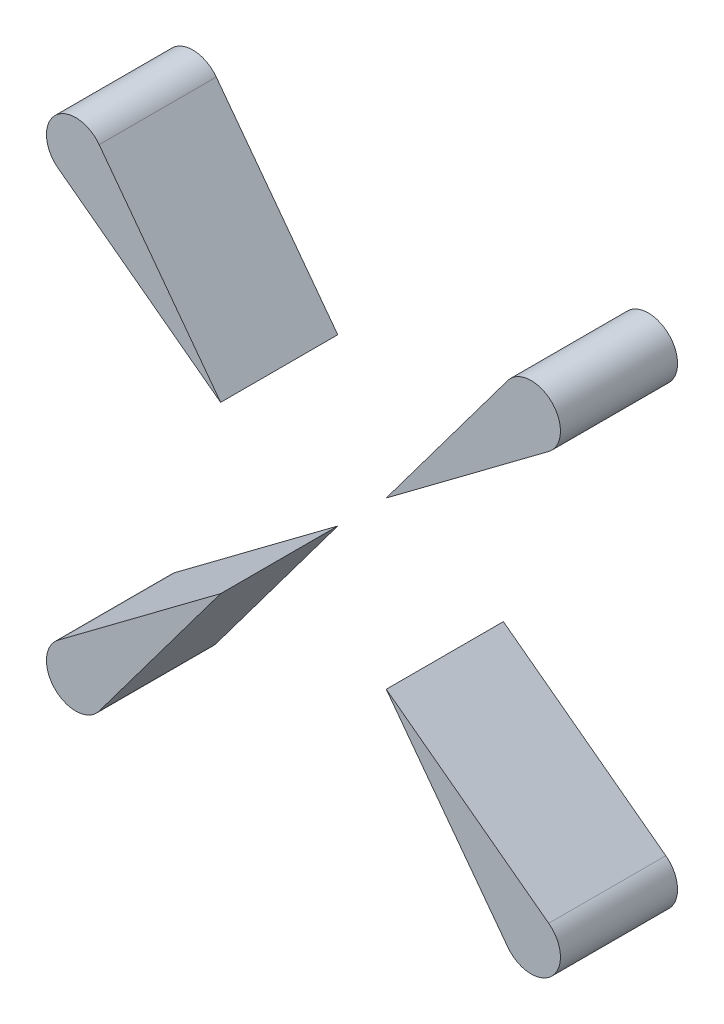
ISO-10303-21;
HEADER;
FILE_DESCRIPTION(('STEP AP214'),'2;1');
FILE_NAME('part.step','',(''),(''),'','','');
FILE_SCHEMA(('AUTOMOTIVE_DESIGN { 1 0 10303 214 1 1 1 1 }'));
ENDSEC;
DATA;
#1=APPLICATION_CONTEXT('core data for automotive mechanical design processes');
#2=APPLICATION_PROTOCOL_DEFINITION('international standard','automotive_design',2000,#1);
#3=PRODUCT_CONTEXT('',#1,'mechanical');
#4=PRODUCT('Part','Part','',(#3));
#5=PRODUCT_RELATED_PRODUCT_CATEGORY('part','',(#4));
#6=PRODUCT_DEFINITION_FORMATION('','',#4);
#7=PRODUCT_DEFINITION_CONTEXT('part definition',#1,'design');
#8=PRODUCT_DEFINITION('design','',#6,#7);
#9=PRODUCT_DEFINITION_SHAPE('','',#8);
#10=(LENGTH_UNIT() NAMED_UNIT(*) SI_UNIT(.MILLI.,.METRE.));
#11=(NAMED_UNIT(*) PLANE_ANGLE_UNIT() SI_UNIT($,.RADIAN.));
#12=(NAMED_UNIT(*) SI_UNIT($,.STERADIAN.) SOLID_ANGLE_UNIT());
#13=UNCERTAINTY_MEASURE_WITH_UNIT(LENGTH_MEASURE(1.E-05),#10,'distance_accuracy_value','');
#14=(GEOMETRIC_REPRESENTATION_CONTEXT(3) GLOBAL_UNCERTAINTY_ASSIGNED_CONTEXT((#13)) GLOBAL_UNIT_ASSIGNED_CONTEXT((#10,
#11,#12)) REPRESENTATION_CONTEXT('',''));
#15=CARTESIAN_POINT('',(0.,0.,0.));
#16=DIRECTION('',(0.,0.,1.));
#17=DIRECTION('',(1.,0.,0.));
#18=AXIS2_PLACEMENT_3D('',#15,#16,#17);
#19=CARTESIAN_POINT('',(-0.707106781186542,0.707106781186553,1.));
#20=DIRECTION('',(0.598838957768551,0.800869466678981,0.));
#21=DIRECTION('',(-0.800869466678981,0.598838957768551,0.));
#22=AXIS2_PLACEMENT_3D('',#19,#20,#21);
#23=PLANE('',#22);
#24=DIRECTION('',(0.800869466678981,-0.598838957768551,0.));
#25=VECTOR('',#24,1.);
#26=CARTESIAN_POINT('',(-0.707106781186542,0.707106781186553,0.));
#27=LINE('',#26,#25);
#28=CARTESIAN_POINT('',(-2.09425338770513,1.74432628159328,0.));
#29=VERTEX_POINT('',#28);
#30=CARTESIAN_POINT('',(-0.707106781186542,0.707106781186553,0.));
#31=VERTEX_POINT('',#30);
#32=EDGE_CURVE('E12',#29,#31,#27,.T.);
#33=ORIENTED_EDGE('',*,*,#32,.T.);
#34=DIRECTION('',(0.,0.,-1.));
#35=VECTOR('',#34,1.);
#36=CARTESIAN_POINT('',(-0.707106781186542,0.707106781186553,1.));
#37=LINE('',#36,#35);
#38=CARTESIAN_POINT('',(-0.707106781186542,0.707106781186553,1.));
#39=VERTEX_POINT('',#38);
#40=EDGE_CURVE('E148',#39,#31,#37,.T.);
#41=ORIENTED_EDGE('',*,*,#40,.F.);
#42=DIRECTION('',(0.800869466678981,-0.598838957768551,0.));
#43=VECTOR('',#42,1.);
#44=CARTESIAN_POINT('',(-0.707106781186542,0.707106781186553,1.));
#45=LINE('',#44,#43);
#46=CARTESIAN_POINT('',(-2.09425338770513,1.74432628159328,1.));
#47=VERTEX_POINT('',#46);
#48=EDGE_CURVE('E52',#47,#39,#45,.T.);
#49=ORIENTED_EDGE('',*,*,#48,.F.);
#50=DIRECTION('',(0.,0.,-1.));
#51=VECTOR('',#50,1.);
#52=CARTESIAN_POINT('',(-2.09425338770513,1.74432628159328,1.));
#53=LINE('',#52,#51);
#54=EDGE_CURVE('E90',#47,#29,#53,.T.);
#55=ORIENTED_EDGE('',*,*,#54,.T.);
#56=EDGE_LOOP('',(#33,#41,#49,#55));
#57=FACE_BOUND('',#56,.T.);
#58=ADVANCED_FACE('F48',(#57),#23,.F.);
#59=CARTESIAN_POINT('',(-1.74432628159324,2.09425338770516,1.));
#60=DIRECTION('',(-0.800869466678991,-0.598838957768537,0.));
#61=DIRECTION('',(0.598838957768537,-0.800869466678992,0.));
#62=AXIS2_PLACEMENT_3D('',#59,#60,#61);
#63=PLANE('',#62);
#64=DIRECTION('',(-0.598838957768537,0.800869466678991,0.));
#65=VECTOR('',#64,1.);
#66=CARTESIAN_POINT('',(-1.74432628159324,2.09425338770516,0.));
#67=LINE('',#66,#65);
#68=CARTESIAN_POINT('',(-1.74432628159324,2.09425338770516,0.));
#69=VERTEX_POINT('',#68);
#70=EDGE_CURVE('E58',#31,#69,#67,.T.);
#71=ORIENTED_EDGE('',*,*,#70,.T.);
#72=DIRECTION('',(0.,0.,-1.));
#73=VECTOR('',#72,1.);
#74=CARTESIAN_POINT('',(-1.74432628159324,2.09425338770516,1.));
#75=LINE('',#74,#73);
#76=CARTESIAN_POINT('',(-1.74432628159324,2.09425338770516,1.));
#77=VERTEX_POINT('',#76);
#78=EDGE_CURVE('E92',#77,#69,#75,.T.);
#79=ORIENTED_EDGE('',*,*,#78,.F.);
#80=DIRECTION('',(-0.598838957768537,0.800869466678991,0.));
#81=VECTOR('',#80,1.);
#82=CARTESIAN_POINT('',(-1.74432628159324,2.09425338770516,1.));
#83=LINE('',#82,#81);
#84=EDGE_CURVE('E79',#39,#77,#83,.T.);
#85=ORIENTED_EDGE('',*,*,#84,.F.);
#86=ORIENTED_EDGE('',*,*,#40,.T.);
#87=EDGE_LOOP('',(#71,#79,#85,#86));
#88=FACE_BOUND('',#87,.T.);
#89=ADVANCED_FACE('F105',(#88),#63,.F.);
#90=CARTESIAN_POINT('',(-1.94454364826299,1.94454364826302,1.));
#91=DIRECTION('',(0.,0.,-1.));
#92=DIRECTION('',(-1.,0.,0.));
#93=AXIS2_PLACEMENT_3D('',#90,#91,#92);
#94=CYLINDRICAL_SURFACE('',#93,0.25);
#95=CARTESIAN_POINT('',(-1.94454364826299,1.94454364826302,0.));
#96=DIRECTION('',(0.,0.,1.));
#97=DIRECTION('',(-1.,0.,0.));
#98=AXIS2_PLACEMENT_3D('',#95,#96,#97);
#99=CIRCLE('',#98,0.25);
#100=EDGE_CURVE('E86',#69,#29,#99,.T.);
#101=ORIENTED_EDGE('',*,*,#100,.T.);
#102=ORIENTED_EDGE('',*,*,#54,.F.);
#103=CARTESIAN_POINT('',(-1.94454364826299,1.94454364826302,1.));
#104=DIRECTION('',(0.,0.,1.));
#105=DIRECTION('',(-1.,0.,0.));
#106=AXIS2_PLACEMENT_3D('',#103,#104,#105);
#107=CIRCLE('',#106,0.25);
#108=EDGE_CURVE('E96',#77,#47,#107,.T.);
#109=ORIENTED_EDGE('',*,*,#108,.F.);
#110=ORIENTED_EDGE('',*,*,#78,.T.);
#111=EDGE_LOOP('',(#101,#102,#109,#110));
#112=FACE_BOUND('',#111,.T.);
#113=ADVANCED_FACE('F88',(#112),#94,.T.);
#114=CARTESIAN_POINT('',(-1.94454364826299,1.94454364826302,1.));
#115=DIRECTION('',(0.,0.,-1.));
#116=DIRECTION('',(-1.,0.,0.));
#117=AXIS2_PLACEMENT_3D('',#114,#115,#116);
#118=PLANE('',#117);
#119=ORIENTED_EDGE('',*,*,#48,.T.);
#120=ORIENTED_EDGE('',*,*,#84,.T.);
#121=ORIENTED_EDGE('',*,*,#108,.T.);
#122=EDGE_LOOP('',(#119,#120,#121));
#123=FACE_BOUND('',#122,.T.);
#124=ADVANCED_FACE('F50',(#123),#118,.F.);
#125=CARTESIAN_POINT('',(-1.94454364826299,1.94454364826302,0.));
#126=DIRECTION('',(0.,0.,-1.));
#127=DIRECTION('',(-1.,0.,0.));
#128=AXIS2_PLACEMENT_3D('',#125,#126,#127);
#129=PLANE('',#128);
#130=ORIENTED_EDGE('',*,*,#32,.F.);
#131=ORIENTED_EDGE('',*,*,#100,.F.);
#132=ORIENTED_EDGE('',*,*,#70,.F.);
#133=EDGE_LOOP('',(#130,#131,#132));
#134=FACE_BOUND('',#133,.T.);
#135=ADVANCED_FACE('F98',(#134),#129,.T.);
#136=CLOSED_SHELL('',(#58,#89,#113,#124,#135));
#137=MANIFOLD_SOLID_BREP('B2',#136);
#138=CARTESIAN_POINT('',(-0.707106781186551,-0.707106781186544,1.));
#139=DIRECTION('',(-0.800869466678983,0.598838957768548,0.));
#140=DIRECTION('',(-0.598838957768548,-0.800869466678984,0.));
#141=AXIS2_PLACEMENT_3D('',#138,#139,#140);
#142=PLANE('',#141);
#143=DIRECTION('',(0.598838957768548,0.800869466678983,0.));
#144=VECTOR('',#143,1.);
#145=CARTESIAN_POINT('',(-0.707106781186551,-0.707106781186544,0.));
#146=LINE('',#145,#144);
#147=CARTESIAN_POINT('',(-1.74432628159327,-2.09425338770513,0.));
#148=VERTEX_POINT('',#147);
#149=CARTESIAN_POINT('',(-0.707106781186551,-0.707106781186544,0.));
#150=VERTEX_POINT('',#149);
#151=EDGE_CURVE('E46',#148,#150,#146,.T.);
#152=ORIENTED_EDGE('',*,*,#151,.T.);
#153=DIRECTION('',(0.,0.,-1.));
#154=VECTOR('',#153,1.);
#155=CARTESIAN_POINT('',(-0.707106781186551,-0.707106781186544,1.));
#156=LINE('',#155,#154);
#157=CARTESIAN_POINT('',(-0.707106781186551,-0.707106781186544,1.));
#158=VERTEX_POINT('',#157);
#159=EDGE_CURVE('E266',#158,#150,#156,.T.);
#160=ORIENTED_EDGE('',*,*,#159,.F.);
#161=DIRECTION('',(0.598838957768548,0.800869466678983,0.));
#162=VECTOR('',#161,1.);
#163=CARTESIAN_POINT('',(-0.707106781186551,-0.707106781186544,1.));
#164=LINE('',#163,#162);
#165=CARTESIAN_POINT('',(-1.74432628159327,-2.09425338770513,1.));
#166=VERTEX_POINT('',#165);
#167=EDGE_CURVE('E170',#166,#158,#164,.T.);
#168=ORIENTED_EDGE('',*,*,#167,.F.);
#169=DIRECTION('',(0.,0.,-1.));
#170=VECTOR('',#169,1.);
#171=CARTESIAN_POINT('',(-1.74432628159327,-2.09425338770513,1.));
#172=LINE('',#171,#170);
#173=EDGE_CURVE('E208',#166,#148,#172,.T.);
#174=ORIENTED_EDGE('',*,*,#173,.T.);
#175=EDGE_LOOP('',(#152,#160,#168,#174));
#176=FACE_BOUND('',#175,.T.);
#177=ADVANCED_FACE('F166',(#176),#142,.F.);
#178=CARTESIAN_POINT('',(-2.09425338770515,-1.74432628159325,1.));
#179=DIRECTION('',(0.59883895776854,-0.800869466678989,0.));
#180=DIRECTION('',(0.800869466678989,0.59883895776854,0.));
#181=AXIS2_PLACEMENT_3D('',#178,#179,#180);
#182=PLANE('',#181);
#183=DIRECTION('',(-0.800869466678989,-0.59883895776854,0.));
#184=VECTOR('',#183,1.);
#185=CARTESIAN_POINT('',(-2.09425338770515,-1.74432628159325,0.));
#186=LINE('',#185,#184);
#187=CARTESIAN_POINT('',(-2.09425338770515,-1.74432628159325,0.));
#188=VERTEX_POINT('',#187);
#189=EDGE_CURVE('E176',#150,#188,#186,.T.);
#190=ORIENTED_EDGE('',*,*,#189,.T.);
#191=DIRECTION('',(0.,0.,-1.));
#192=VECTOR('',#191,1.);
#193=CARTESIAN_POINT('',(-2.09425338770515,-1.74432628159325,1.));
#194=LINE('',#193,#192);
#195=CARTESIAN_POINT('',(-2.09425338770515,-1.74432628159325,1.));
#196=VERTEX_POINT('',#195);
#197=EDGE_CURVE('E210',#196,#188,#194,.T.);
#198=ORIENTED_EDGE('',*,*,#197,.F.);
#199=DIRECTION('',(-0.800869466678989,-0.59883895776854,0.));
#200=VECTOR('',#199,1.);
#201=CARTESIAN_POINT('',(-2.09425338770515,-1.74432628159325,1.));
#202=LINE('',#201,#200);
#203=EDGE_CURVE('E197',#158,#196,#202,.T.);
#204=ORIENTED_EDGE('',*,*,#203,.F.);
#205=ORIENTED_EDGE('',*,*,#159,.T.);
#206=EDGE_LOOP('',(#190,#198,#204,#205));
#207=FACE_BOUND('',#206,.T.);
#208=ADVANCED_FACE('F223',(#207),#182,.F.);
#209=CARTESIAN_POINT('',(-1.94454364826302,-1.944543648263,1.));
#210=DIRECTION('',(0.,0.,-1.));
#211=DIRECTION('',(-1.,0.,0.));
#212=AXIS2_PLACEMENT_3D('',#209,#210,#211);
#213=CYLINDRICAL_SURFACE('',#212,0.25);
#214=CARTESIAN_POINT('',(-1.94454364826302,-1.944543648263,0.));
#215=DIRECTION('',(0.,0.,1.));
#216=DIRECTION('',(-1.,0.,0.));
#217=AXIS2_PLACEMENT_3D('',#214,#215,#216);
#218=CIRCLE('',#217,0.25);
#219=EDGE_CURVE('E204',#188,#148,#218,.T.);
#220=ORIENTED_EDGE('',*,*,#219,.T.);
#221=ORIENTED_EDGE('',*,*,#173,.F.);
#222=CARTESIAN_POINT('',(-1.94454364826302,-1.944543648263,1.));
#223=DIRECTION('',(0.,0.,1.));
#224=DIRECTION('',(-1.,0.,0.));
#225=AXIS2_PLACEMENT_3D('',#222,#223,#224);
#226=CIRCLE('',#225,0.25);
#227=EDGE_CURVE('E214',#196,#166,#226,.T.);
#228=ORIENTED_EDGE('',*,*,#227,.F.);
#229=ORIENTED_EDGE('',*,*,#197,.T.);
#230=EDGE_LOOP('',(#220,#221,#228,#229));
#231=FACE_BOUND('',#230,.T.);
#232=ADVANCED_FACE('F206',(#231),#213,.T.);
#233=CARTESIAN_POINT('',(-1.94454364826302,-1.944543648263,1.));
#234=DIRECTION('',(0.,0.,-1.));
#235=DIRECTION('',(-1.,0.,0.));
#236=AXIS2_PLACEMENT_3D('',#233,#234,#235);
#237=PLANE('',#236);
#238=ORIENTED_EDGE('',*,*,#167,.T.);
#239=ORIENTED_EDGE('',*,*,#203,.T.);
#240=ORIENTED_EDGE('',*,*,#227,.T.);
#241=EDGE_LOOP('',(#238,#239,#240));
#242=FACE_BOUND('',#241,.T.);
#243=ADVANCED_FACE('F168',(#242),#237,.F.);
#244=CARTESIAN_POINT('',(-1.94454364826302,-1.944543648263,0.));
#245=DIRECTION('',(0.,0.,-1.));
#246=DIRECTION('',(-1.,0.,0.));
#247=AXIS2_PLACEMENT_3D('',#244,#245,#246);
#248=PLANE('',#247);
#249=ORIENTED_EDGE('',*,*,#151,.F.);
#250=ORIENTED_EDGE('',*,*,#219,.F.);
#251=ORIENTED_EDGE('',*,*,#189,.F.);
#252=EDGE_LOOP('',(#249,#250,#251));
#253=FACE_BOUND('',#252,.T.);
#254=ADVANCED_FACE('F216',(#253),#248,.T.);
#255=CLOSED_SHELL('',(#177,#208,#232,#243,#254));
#256=MANIFOLD_SOLID_BREP('B6',#255);
#257=CARTESIAN_POINT('',(0.707106781186546,-0.707106781186549,1.));
#258=DIRECTION('',(-0.598838957768545,-0.800869466678985,0.));
#259=DIRECTION('',(0.800869466678985,-0.598838957768545,0.));
#260=AXIS2_PLACEMENT_3D('',#257,#258,#259);
#261=PLANE('',#260);
#262=DIRECTION('',(-0.800869466678985,0.598838957768545,0.));
#263=VECTOR('',#262,1.);
#264=CARTESIAN_POINT('',(0.707106781186546,-0.707106781186549,0.));
#265=LINE('',#264,#263);
#266=CARTESIAN_POINT('',(2.09425338770514,-1.74432628159326,0.));
#267=VERTEX_POINT('',#266);
#268=CARTESIAN_POINT('',(0.707106781186546,-0.707106781186549,0.));
#269=VERTEX_POINT('',#268);
#270=EDGE_CURVE('E164',#267,#269,#265,.T.);
#271=ORIENTED_EDGE('',*,*,#270,.T.);
#272=DIRECTION('',(0.,0.,-1.));
#273=VECTOR('',#272,1.);
#274=CARTESIAN_POINT('',(0.707106781186546,-0.707106781186549,1.));
#275=LINE('',#274,#273);
#276=CARTESIAN_POINT('',(0.707106781186546,-0.707106781186549,1.));
#277=VERTEX_POINT('',#276);
#278=EDGE_CURVE('E383',#277,#269,#275,.T.);
#279=ORIENTED_EDGE('',*,*,#278,.F.);
#280=DIRECTION('',(-0.800869466678985,0.598838957768545,0.));
#281=VECTOR('',#280,1.);
#282=CARTESIAN_POINT('',(0.707106781186546,-0.707106781186549,1.));
#283=LINE('',#282,#281);
#284=CARTESIAN_POINT('',(2.09425338770514,-1.74432628159326,1.));
#285=VERTEX_POINT('',#284);
#286=EDGE_CURVE('E287',#285,#277,#283,.T.);
#287=ORIENTED_EDGE('',*,*,#286,.F.);
#288=DIRECTION('',(0.,0.,-1.));
#289=VECTOR('',#288,1.);
#290=CARTESIAN_POINT('',(2.09425338770514,-1.74432628159326,1.));
#291=LINE('',#290,#289);
#292=EDGE_CURVE('E325',#285,#267,#291,.T.);
#293=ORIENTED_EDGE('',*,*,#292,.T.);
#294=EDGE_LOOP('',(#271,#279,#287,#293));
#295=FACE_BOUND('',#294,.T.);
#296=ADVANCED_FACE('F283',(#295),#261,.F.);
#297=CARTESIAN_POINT('',(1.74432628159326,-2.09425338770514,1.));
#298=DIRECTION('',(0.800869466678987,0.598838957768543,0.));
#299=DIRECTION('',(-0.598838957768543,0.800869466678987,0.));
#300=AXIS2_PLACEMENT_3D('',#297,#298,#299);
#301=PLANE('',#300);
#302=DIRECTION('',(0.598838957768543,-0.800869466678987,0.));
#303=VECTOR('',#302,1.);
#304=CARTESIAN_POINT('',(1.74432628159326,-2.09425338770514,0.));
#305=LINE('',#304,#303);
#306=CARTESIAN_POINT('',(1.74432628159326,-2.09425338770514,0.));
#307=VERTEX_POINT('',#306);
#308=EDGE_CURVE('E293',#269,#307,#305,.T.);
#309=ORIENTED_EDGE('',*,*,#308,.T.);
#310=DIRECTION('',(0.,0.,-1.));
#311=VECTOR('',#310,1.);
#312=CARTESIAN_POINT('',(1.74432628159326,-2.09425338770514,1.));
#313=LINE('',#312,#311);
#314=CARTESIAN_POINT('',(1.74432628159326,-2.09425338770514,1.));
#315=VERTEX_POINT('',#314);
#316=EDGE_CURVE('E327',#315,#307,#313,.T.);
#317=ORIENTED_EDGE('',*,*,#316,.F.);
#318=DIRECTION('',(0.598838957768543,-0.800869466678987,0.));
#319=VECTOR('',#318,1.);
#320=CARTESIAN_POINT('',(1.74432628159326,-2.09425338770514,1.));
#321=LINE('',#320,#319);
#322=EDGE_CURVE('E314',#277,#315,#321,.T.);
#323=ORIENTED_EDGE('',*,*,#322,.F.);
#324=ORIENTED_EDGE('',*,*,#278,.T.);
#325=EDGE_LOOP('',(#309,#317,#323,#324));
#326=FACE_BOUND('',#325,.T.);
#327=ADVANCED_FACE('F340',(#326),#301,.F.);
#328=CARTESIAN_POINT('',(1.944543648263,-1.94454364826301,1.));
#329=DIRECTION('',(0.,0.,-1.));
#330=DIRECTION('',(-1.,0.,0.));
#331=AXIS2_PLACEMENT_3D('',#328,#329,#330);
#332=CYLINDRICAL_SURFACE('',#331,0.25);
#333=CARTESIAN_POINT('',(1.944543648263,-1.94454364826301,0.));
#334=DIRECTION('',(0.,0.,1.));
#335=DIRECTION('',(-1.,0.,0.));
#336=AXIS2_PLACEMENT_3D('',#333,#334,#335);
#337=CIRCLE('',#336,0.25);
#338=EDGE_CURVE('E321',#307,#267,#337,.T.);
#339=ORIENTED_EDGE('',*,*,#338,.T.);
#340=ORIENTED_EDGE('',*,*,#292,.F.);
#341=CARTESIAN_POINT('',(1.944543648263,-1.94454364826301,1.));
#342=DIRECTION('',(0.,0.,1.));
#343=DIRECTION('',(-1.,0.,0.));
#344=AXIS2_PLACEMENT_3D('',#341,#342,#343);
#345=CIRCLE('',#344,0.25);
#346=EDGE_CURVE('E331',#315,#285,#345,.T.);
#347=ORIENTED_EDGE('',*,*,#346,.F.);
#348=ORIENTED_EDGE('',*,*,#316,.T.);
#349=EDGE_LOOP('',(#339,#340,#347,#348));
#350=FACE_BOUND('',#349,.T.);
#351=ADVANCED_FACE('F323',(#350),#332,.T.);
#352=CARTESIAN_POINT('',(1.944543648263,-1.94454364826301,1.));
#353=DIRECTION('',(0.,0.,-1.));
#354=DIRECTION('',(-1.,0.,0.));
#355=AXIS2_PLACEMENT_3D('',#352,#353,#354);
#356=PLANE('',#355);
#357=ORIENTED_EDGE('',*,*,#286,.T.);
#358=ORIENTED_EDGE('',*,*,#322,.T.);
#359=ORIENTED_EDGE('',*,*,#346,.T.);
#360=EDGE_LOOP('',(#357,#358,#359));
#361=FACE_BOUND('',#360,.T.);
#362=ADVANCED_FACE('F285',(#361),#356,.F.);
#363=CARTESIAN_POINT('',(1.944543648263,-1.94454364826301,0.));
#364=DIRECTION('',(0.,0.,-1.));
#365=DIRECTION('',(-1.,0.,0.));
#366=AXIS2_PLACEMENT_3D('',#363,#364,#365);
#367=PLANE('',#366);
#368=ORIENTED_EDGE('',*,*,#270,.F.);
#369=ORIENTED_EDGE('',*,*,#338,.F.);
#370=ORIENTED_EDGE('',*,*,#308,.F.);
#371=EDGE_LOOP('',(#368,#369,#370));
#372=FACE_BOUND('',#371,.T.);
#373=ADVANCED_FACE('F333',(#372),#367,.T.);
#374=CLOSED_SHELL('',(#296,#327,#351,#362,#373));
#375=MANIFOLD_SOLID_BREP('B40',#374);
#376=CARTESIAN_POINT('',(2.09425338770514,1.74432628159326,1.));
#377=DIRECTION('',(-0.598838957768545,0.800869466678985,0.));
#378=DIRECTION('',(-0.800869466678986,-0.598838957768545,0.));
#379=AXIS2_PLACEMENT_3D('',#376,#377,#378);
#380=PLANE('',#379);
#381=DIRECTION('',(0.800869466678985,0.598838957768545,0.));
#382=VECTOR('',#381,1.);
#383=CARTESIAN_POINT('',(2.09425338770514,1.74432628159326,0.));
#384=LINE('',#383,#382);
#385=CARTESIAN_POINT('',(0.707106781186546,0.707106781186549,0.));
#386=VERTEX_POINT('',#385);
#387=CARTESIAN_POINT('',(2.09425338770514,1.74432628159326,0.));
#388=VERTEX_POINT('',#387);
#389=EDGE_CURVE('E438',#386,#388,#384,.T.);
#390=ORIENTED_EDGE('',*,*,#389,.T.);
#391=DIRECTION('',(0.,0.,-1.));
#392=VECTOR('',#391,1.);
#393=CARTESIAN_POINT('',(2.09425338770514,1.74432628159326,1.));
#394=LINE('',#393,#392);
#395=CARTESIAN_POINT('',(2.09425338770514,1.74432628159326,1.));
#396=VERTEX_POINT('',#395);
#397=EDGE_CURVE('E281',#396,#388,#394,.T.);
#398=ORIENTED_EDGE('',*,*,#397,.F.);
#399=DIRECTION('',(0.800869466678985,0.598838957768545,0.));
#400=VECTOR('',#399,1.);
#401=CARTESIAN_POINT('',(2.09425338770514,1.74432628159326,1.));
#402=LINE('',#401,#400);
#403=CARTESIAN_POINT('',(0.707106781186546,0.707106781186549,1.));
#404=VERTEX_POINT('',#403);
#405=EDGE_CURVE('E431',#404,#396,#402,.T.);
#406=ORIENTED_EDGE('',*,*,#405,.F.);
#407=DIRECTION('',(0.,0.,-1.));
#408=VECTOR('',#407,1.);
#409=CARTESIAN_POINT('',(0.707106781186546,0.707106781186549,1.));
#410=LINE('',#409,#408);
#411=EDGE_CURVE('E439',#404,#386,#410,.T.);
#412=ORIENTED_EDGE('',*,*,#411,.T.);
#413=EDGE_LOOP('',(#390,#398,#406,#412));
#414=FACE_BOUND('',#413,.T.);
#415=ADVANCED_FACE('F391',(#414),#380,.F.);
#416=CARTESIAN_POINT('',(1.944543648263,1.94454364826301,1.));
#417=DIRECTION('',(0.,0.,-1.));
#418=DIRECTION('',(-1.,0.,0.));
#419=AXIS2_PLACEMENT_3D('',#416,#417,#418);
#420=CYLINDRICAL_SURFACE('',#419,0.25);
#421=CARTESIAN_POINT('',(1.944543648263,1.94454364826301,0.));
#422=DIRECTION('',(0.,0.,1.));
#423=DIRECTION('',(-1.,0.,0.));
#424=AXIS2_PLACEMENT_3D('',#421,#422,#423);
#425=CIRCLE('',#424,0.25);
#426=CARTESIAN_POINT('',(1.74432628159325,2.09425338770515,0.));
#427=VERTEX_POINT('',#426);
#428=EDGE_CURVE('E419',#388,#427,#425,.T.);
#429=ORIENTED_EDGE('',*,*,#428,.T.);
#430=DIRECTION('',(0.,0.,-1.));
#431=VECTOR('',#430,1.);
#432=CARTESIAN_POINT('',(1.74432628159325,2.09425338770515,1.));
#433=LINE('',#432,#431);
#434=CARTESIAN_POINT('',(1.74432628159325,2.09425338770515,1.));
#435=VERTEX_POINT('',#434);
#436=EDGE_CURVE('E399',#435,#427,#433,.T.);
#437=ORIENTED_EDGE('',*,*,#436,.F.);
#438=CARTESIAN_POINT('',(1.944543648263,1.94454364826301,1.));
#439=DIRECTION('',(0.,0.,1.));
#440=DIRECTION('',(-1.,0.,0.));
#441=AXIS2_PLACEMENT_3D('',#438,#439,#440);
#442=CIRCLE('',#441,0.25);
#443=EDGE_CURVE('E427',#396,#435,#442,.T.);
#444=ORIENTED_EDGE('',*,*,#443,.F.);
#445=ORIENTED_EDGE('',*,*,#397,.T.);
#446=EDGE_LOOP('',(#429,#437,#444,#445));
#447=FACE_BOUND('',#446,.T.);
#448=ADVANCED_FACE('F428',(#447),#420,.T.);
#449=CARTESIAN_POINT('',(0.707106781186546,0.707106781186549,1.));
#450=DIRECTION('',(0.800869466678987,-0.598838957768543,0.));
#451=DIRECTION('',(0.598838957768543,0.800869466678987,0.));
#452=AXIS2_PLACEMENT_3D('',#449,#450,#451);
#453=PLANE('',#452);
#454=DIRECTION('',(-0.598838957768543,-0.800869466678987,0.));
#455=VECTOR('',#454,1.);
#456=CARTESIAN_POINT('',(0.707106781186546,0.707106781186549,0.));
#457=LINE('',#456,#455);
#458=EDGE_CURVE('E424',#427,#386,#457,.T.);
#459=ORIENTED_EDGE('',*,*,#458,.T.);
#460=ORIENTED_EDGE('',*,*,#411,.F.);
#461=DIRECTION('',(-0.598838957768543,-0.800869466678987,0.));
#462=VECTOR('',#461,1.);
#463=CARTESIAN_POINT('',(0.707106781186546,0.707106781186549,1.));
#464=LINE('',#463,#462);
#465=EDGE_CURVE('E407',#435,#404,#464,.T.);
#466=ORIENTED_EDGE('',*,*,#465,.F.);
#467=ORIENTED_EDGE('',*,*,#436,.T.);
#468=EDGE_LOOP('',(#459,#460,#466,#467));
#469=FACE_BOUND('',#468,.T.);
#470=ADVANCED_FACE('F446',(#469),#453,.F.);
#471=CARTESIAN_POINT('',(1.944543648263,1.94454364826301,1.));
#472=DIRECTION('',(0.,0.,-1.));
#473=DIRECTION('',(-1.,0.,0.));
#474=AXIS2_PLACEMENT_3D('',#471,#472,#473);
#475=PLANE('',#474);
#476=ORIENTED_EDGE('',*,*,#405,.T.);
#477=ORIENTED_EDGE('',*,*,#443,.T.);
#478=ORIENTED_EDGE('',*,*,#465,.T.);
#479=EDGE_LOOP('',(#476,#477,#478));
#480=FACE_BOUND('',#479,.T.);
#481=ADVANCED_FACE('F434',(#480),#475,.F.);
#482=CARTESIAN_POINT('',(1.944543648263,1.94454364826301,0.));
#483=DIRECTION('',(0.,0.,-1.));
#484=DIRECTION('',(-1.,0.,0.));
#485=AXIS2_PLACEMENT_3D('',#482,#483,#484);
#486=PLANE('',#485);
#487=ORIENTED_EDGE('',*,*,#389,.F.);
#488=ORIENTED_EDGE('',*,*,#458,.F.);
#489=ORIENTED_EDGE('',*,*,#428,.F.);
#490=EDGE_LOOP('',(#487,#488,#489));
#491=FACE_BOUND('',#490,.T.);
#492=ADVANCED_FACE('F447',(#491),#486,.T.);
#493=CLOSED_SHELL('',(#415,#448,#470,#481,#492));
#494=MANIFOLD_SOLID_BREP('B158',#493);
#495=ADVANCED_BREP_SHAPE_REPRESENTATION('',(#18,#137,#256,#375,#494),#14);
#496=SHAPE_DEFINITION_REPRESENTATION(#9,#495);
ENDSEC;
END-ISO-10303-21;
